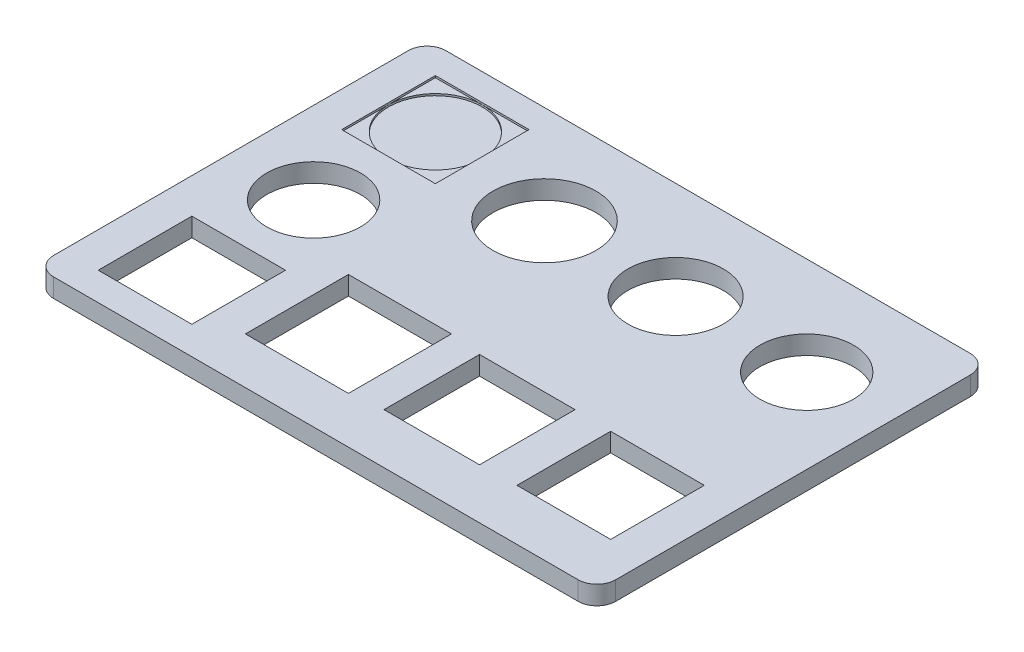
ISO-10303-21;
HEADER;
FILE_DESCRIPTION(('STEP AP214'),'2;1');
FILE_NAME('part.step','',(''),(''),'','','');
FILE_SCHEMA(('AUTOMOTIVE_DESIGN { 1 0 10303 214 1 1 1 1 }'));
ENDSEC;
DATA;
#1=APPLICATION_CONTEXT('core data for automotive mechanical design processes');
#2=APPLICATION_PROTOCOL_DEFINITION('international standard','automotive_design',2000,#1);
#3=PRODUCT_CONTEXT('',#1,'mechanical');
#4=PRODUCT('Part','Part','',(#3));
#5=PRODUCT_RELATED_PRODUCT_CATEGORY('part','',(#4));
#6=PRODUCT_DEFINITION_FORMATION('','',#4);
#7=PRODUCT_DEFINITION_CONTEXT('part definition',#1,'design');
#8=PRODUCT_DEFINITION('design','',#6,#7);
#9=PRODUCT_DEFINITION_SHAPE('','',#8);
#10=(LENGTH_UNIT() NAMED_UNIT(*) SI_UNIT(.MILLI.,.METRE.));
#11=(NAMED_UNIT(*) PLANE_ANGLE_UNIT() SI_UNIT($,.RADIAN.));
#12=(NAMED_UNIT(*) SI_UNIT($,.STERADIAN.) SOLID_ANGLE_UNIT());
#13=UNCERTAINTY_MEASURE_WITH_UNIT(LENGTH_MEASURE(1.E-05),#10,'distance_accuracy_value','');
#14=(GEOMETRIC_REPRESENTATION_CONTEXT(3) GLOBAL_UNCERTAINTY_ASSIGNED_CONTEXT((#13)) GLOBAL_UNIT_ASSIGNED_CONTEXT((#10,
#11,#12)) REPRESENTATION_CONTEXT('',''));
#15=CARTESIAN_POINT('',(0.,0.,0.));
#16=DIRECTION('',(0.,0.,1.));
#17=DIRECTION('',(1.,0.,0.));
#18=AXIS2_PLACEMENT_3D('',#15,#16,#17);
#19=CARTESIAN_POINT('',(0.,9.,0.));
#20=DIRECTION('',(0.,1.,0.));
#21=DIRECTION('',(0.,0.,1.));
#22=AXIS2_PLACEMENT_3D('',#19,#20,#21);
#23=PLANE('',#22);
#24=CARTESIAN_POINT('',(43.75,9.,-170.));
#25=DIRECTION('',(0.,1.,0.));
#26=DIRECTION('',(0.,0.,1.));
#27=AXIS2_PLACEMENT_3D('',#24,#25,#26);
#28=CIRCLE('',#27,25.);
#29=CARTESIAN_POINT('',(43.75,9.,-145.));
#30=VERTEX_POINT('',#29);
#31=CARTESIAN_POINT('',(68.75,9.,-170.));
#32=VERTEX_POINT('',#31);
#33=EDGE_CURVE('E51',#30,#32,#28,.T.);
#34=ORIENTED_EDGE('',*,*,#33,.F.);
#35=DIRECTION('',(1.,0.,0.));
#36=VECTOR('',#35,1.);
#37=CARTESIAN_POINT('',(18.75,9.,-145.));
#38=LINE('',#37,#36);
#39=CARTESIAN_POINT('',(68.75,9.,-145.));
#40=VERTEX_POINT('',#39);
#41=EDGE_CURVE('E244',#30,#40,#38,.T.);
#42=ORIENTED_EDGE('',*,*,#41,.T.);
#43=DIRECTION('',(0.,0.,-1.));
#44=VECTOR('',#43,1.);
#45=CARTESIAN_POINT('',(68.75,9.,-195.));
#46=LINE('',#45,#44);
#47=EDGE_CURVE('E246',#40,#32,#46,.T.);
#48=ORIENTED_EDGE('',*,*,#47,.T.);
#49=EDGE_LOOP('',(#34,#42,#48));
#50=FACE_BOUND('',#49,.T.);
#51=ADVANCED_FACE('F39',(#50),#23,.T.);
#52=CARTESIAN_POINT('',(43.75,9.,-195.));
#53=VERTEX_POINT('',#52);
#54=EDGE_CURVE('E11',#32,#53,#28,.T.);
#55=ORIENTED_EDGE('',*,*,#54,.F.);
#56=CARTESIAN_POINT('',(68.75,9.,-195.));
#57=VERTEX_POINT('',#56);
#58=EDGE_CURVE('E261',#32,#57,#46,.T.);
#59=ORIENTED_EDGE('',*,*,#58,.T.);
#60=DIRECTION('',(-1.,0.,0.));
#61=VECTOR('',#60,1.);
#62=CARTESIAN_POINT('',(18.75,9.,-195.));
#63=LINE('',#62,#61);
#64=EDGE_CURVE('E328',#57,#53,#63,.T.);
#65=ORIENTED_EDGE('',*,*,#64,.T.);
#66=EDGE_LOOP('',(#55,#59,#65));
#67=FACE_BOUND('',#66,.T.);
#68=ADVANCED_FACE('F632',(#67),#23,.T.);
#69=CARTESIAN_POINT('',(18.75,9.,-170.));
#70=VERTEX_POINT('',#69);
#71=EDGE_CURVE('E49',#53,#70,#28,.T.);
#72=ORIENTED_EDGE('',*,*,#71,.F.);
#73=CARTESIAN_POINT('',(18.75,9.,-195.));
#74=VERTEX_POINT('',#73);
#75=EDGE_CURVE('E660',#53,#74,#63,.T.);
#76=ORIENTED_EDGE('',*,*,#75,.T.);
#77=DIRECTION('',(0.,0.,1.));
#78=VECTOR('',#77,1.);
#79=CARTESIAN_POINT('',(18.75,9.,-195.));
#80=LINE('',#79,#78);
#81=EDGE_CURVE('E257',#74,#70,#80,.T.);
#82=ORIENTED_EDGE('',*,*,#81,.T.);
#83=EDGE_LOOP('',(#72,#76,#82));
#84=FACE_BOUND('',#83,.T.);
#85=ADVANCED_FACE('F637',(#84),#23,.T.);
#86=CARTESIAN_POINT('',(0.,10.,0.));
#87=DIRECTION('',(0.,-1.,0.));
#88=DIRECTION('',(0.,0.,-1.));
#89=AXIS2_PLACEMENT_3D('',#86,#87,#88);
#90=PLANE('',#89);
#91=DIRECTION('',(1.,0.,0.));
#92=VECTOR('',#91,1.);
#93=CARTESIAN_POINT('',(68.75,10.,-15.));
#94=LINE('',#93,#92);
#95=CARTESIAN_POINT('',(18.75,10.,-15.));
#96=VERTEX_POINT('',#95);
#97=CARTESIAN_POINT('',(68.75,10.,-15.));
#98=VERTEX_POINT('',#97);
#99=EDGE_CURVE('E290',#96,#98,#94,.T.);
#100=ORIENTED_EDGE('',*,*,#99,.F.);
#101=DIRECTION('',(0.,0.,1.));
#102=VECTOR('',#101,1.);
#103=CARTESIAN_POINT('',(18.75,10.,-15.));
#104=LINE('',#103,#102);
#105=CARTESIAN_POINT('',(18.75,10.,-65.));
#106=VERTEX_POINT('',#105);
#107=EDGE_CURVE('E287',#106,#96,#104,.T.);
#108=ORIENTED_EDGE('',*,*,#107,.F.);
#109=DIRECTION('',(-1.,0.,0.));
#110=VECTOR('',#109,1.);
#111=CARTESIAN_POINT('',(68.75,10.,-65.));
#112=LINE('',#111,#110);
#113=CARTESIAN_POINT('',(68.75,10.,-65.));
#114=VERTEX_POINT('',#113);
#115=EDGE_CURVE('E274',#114,#106,#112,.T.);
#116=ORIENTED_EDGE('',*,*,#115,.F.);
#117=DIRECTION('',(0.,0.,-1.));
#118=VECTOR('',#117,1.);
#119=CARTESIAN_POINT('',(68.75,10.,-15.));
#120=LINE('',#119,#118);
#121=EDGE_CURVE('E295',#98,#114,#120,.T.);
#122=ORIENTED_EDGE('',*,*,#121,.F.);
#123=EDGE_LOOP('',(#100,#108,#116,#122));
#124=FACE_BOUND('',#123,.T.);
#125=CARTESIAN_POINT('',(43.75,10.,-105.));
#126=DIRECTION('',(0.,1.,0.));
#127=DIRECTION('',(0.,0.,1.));
#128=AXIS2_PLACEMENT_3D('',#125,#126,#127);
#129=CIRCLE('',#128,25.);
#130=CARTESIAN_POINT('',(43.75,10.,-80.));
#131=VERTEX_POINT('',#130);
#132=EDGE_CURVE('E318',#131,#131,#129,.T.);
#133=ORIENTED_EDGE('',*,*,#132,.F.);
#134=EDGE_LOOP('',(#133));
#135=FACE_BOUND('',#134,.T.);
#136=DIRECTION('',(1.,0.,0.));
#137=VECTOR('',#136,1.);
#138=CARTESIAN_POINT('',(68.75,10.,-145.));
#139=LINE('',#138,#137);
#140=CARTESIAN_POINT('',(18.75,10.,-145.));
#141=VERTEX_POINT('',#140);
#142=CARTESIAN_POINT('',(68.75,10.,-145.));
#143=VERTEX_POINT('',#142);
#144=EDGE_CURVE('E327',#141,#143,#139,.T.);
#145=ORIENTED_EDGE('',*,*,#144,.F.);
#146=DIRECTION('',(0.,0.,1.));
#147=VECTOR('',#146,1.);
#148=CARTESIAN_POINT('',(18.75,10.,-145.));
#149=LINE('',#148,#147);
#150=CARTESIAN_POINT('',(18.75,10.,-195.));
#151=VERTEX_POINT('',#150);
#152=EDGE_CURVE('E323',#151,#141,#149,.T.);
#153=ORIENTED_EDGE('',*,*,#152,.F.);
#154=DIRECTION('',(-1.,0.,0.));
#155=VECTOR('',#154,1.);
#156=CARTESIAN_POINT('',(68.75,10.,-195.));
#157=LINE('',#156,#155);
#158=CARTESIAN_POINT('',(68.75,10.,-195.));
#159=VERTEX_POINT('',#158);
#160=EDGE_CURVE('E335',#159,#151,#157,.T.);
#161=ORIENTED_EDGE('',*,*,#160,.F.);
#162=DIRECTION('',(0.,0.,-1.));
#163=VECTOR('',#162,1.);
#164=CARTESIAN_POINT('',(68.75,10.,-145.));
#165=LINE('',#164,#163);
#166=EDGE_CURVE('E331',#143,#159,#165,.T.);
#167=ORIENTED_EDGE('',*,*,#166,.F.);
#168=EDGE_LOOP('',(#145,#153,#161,#167));
#169=FACE_BOUND('',#168,.T.);
#170=DIRECTION('',(0.,0.,-1.));
#171=VECTOR('',#170,1.);
#172=CARTESIAN_POINT('',(210.5,10.,-26.833));
#173=LINE('',#172,#171);
#174=CARTESIAN_POINT('',(210.5,10.,-26.833));
#175=VERTEX_POINT('',#174);
#176=CARTESIAN_POINT('',(210.5,10.,-77.833));
#177=VERTEX_POINT('',#176);
#178=EDGE_CURVE('E392',#175,#177,#173,.T.);
#179=ORIENTED_EDGE('',*,*,#178,.F.);
#180=DIRECTION('',(1.,0.,0.));
#181=VECTOR('',#180,1.);
#182=CARTESIAN_POINT('',(159.5,10.,-26.833));
#183=LINE('',#182,#181);
#184=CARTESIAN_POINT('',(159.5,10.,-26.833));
#185=VERTEX_POINT('',#184);
#186=EDGE_CURVE('E403',#185,#175,#183,.T.);
#187=ORIENTED_EDGE('',*,*,#186,.F.);
#188=DIRECTION('',(0.,0.,1.));
#189=VECTOR('',#188,1.);
#190=CARTESIAN_POINT('',(159.5,10.,-26.833));
#191=LINE('',#190,#189);
#192=CARTESIAN_POINT('',(159.5,10.,-77.833));
#193=VERTEX_POINT('',#192);
#194=EDGE_CURVE('E399',#193,#185,#191,.T.);
#195=ORIENTED_EDGE('',*,*,#194,.F.);
#196=DIRECTION('',(-1.,0.,0.));
#197=VECTOR('',#196,1.);
#198=CARTESIAN_POINT('',(159.5,10.,-77.833));
#199=LINE('',#198,#197);
#200=EDGE_CURVE('E395',#177,#193,#199,.T.);
#201=ORIENTED_EDGE('',*,*,#200,.F.);
#202=EDGE_LOOP('',(#179,#187,#195,#201));
#203=FACE_BOUND('',#202,.T.);
#204=CARTESIAN_POINT('',(115.,10.,-156.999));
#205=DIRECTION('',(0.,1.,0.));
#206=DIRECTION('',(0.,0.,1.));
#207=AXIS2_PLACEMENT_3D('',#204,#205,#206);
#208=CIRCLE('',#207,27.5);
#209=CARTESIAN_POINT('',(115.,10.,-129.499));
#210=VERTEX_POINT('',#209);
#211=EDGE_CURVE('E494',#210,#210,#208,.T.);
#212=ORIENTED_EDGE('',*,*,#211,.F.);
#213=EDGE_LOOP('',(#212));
#214=FACE_BOUND('',#213,.T.);
#215=DIRECTION('',(0.,0.,1.));
#216=VECTOR('',#215,1.);
#217=CARTESIAN_POINT('',(0.,10.,0.));
#218=LINE('',#217,#216);
#219=CARTESIAN_POINT('',(0.,10.,-199.332));
#220=VERTEX_POINT('',#219);
#221=CARTESIAN_POINT('',(0.,10.,-9.99999999999999));
#222=VERTEX_POINT('',#221);
#223=EDGE_CURVE('E502',#220,#222,#218,.T.);
#224=ORIENTED_EDGE('',*,*,#223,.T.);
#225=CARTESIAN_POINT('',(10.,10.,-9.99999999999999));
#226=DIRECTION('',(0.,-1.,0.));
#227=DIRECTION('',(0.,0.,-1.));
#228=AXIS2_PLACEMENT_3D('',#225,#226,#227);
#229=CIRCLE('',#228,10.);
#230=CARTESIAN_POINT('',(9.99999999999999,10.,0.));
#231=VERTEX_POINT('',#230);
#232=EDGE_CURVE('E568',#222,#231,#229,.F.);
#233=ORIENTED_EDGE('',*,*,#232,.T.);
#234=DIRECTION('',(1.,0.,0.));
#235=VECTOR('',#234,1.);
#236=CARTESIAN_POINT('',(0.,10.,0.));
#237=LINE('',#236,#235);
#238=CARTESIAN_POINT('',(290.,10.,1.60982338570648E-13));
#239=VERTEX_POINT('',#238);
#240=EDGE_CURVE('E506',#231,#239,#237,.T.);
#241=ORIENTED_EDGE('',*,*,#240,.T.);
#242=CARTESIAN_POINT('',(290.,10.,-9.99999999999984));
#243=DIRECTION('',(0.,-1.,0.));
#244=DIRECTION('',(0.,0.,-1.));
#245=AXIS2_PLACEMENT_3D('',#242,#243,#244);
#246=CIRCLE('',#245,10.);
#247=CARTESIAN_POINT('',(300.,10.,-9.99999999999984));
#248=VERTEX_POINT('',#247);
#249=EDGE_CURVE('E559',#239,#248,#246,.F.);
#250=ORIENTED_EDGE('',*,*,#249,.T.);
#251=DIRECTION('',(0.,0.,-1.));
#252=VECTOR('',#251,1.);
#253=CARTESIAN_POINT('',(300.,10.,1.66533453693773E-13));
#254=LINE('',#253,#252);
#255=CARTESIAN_POINT('',(300.,10.,-199.332));
#256=VERTEX_POINT('',#255);
#257=EDGE_CURVE('E511',#248,#256,#254,.T.);
#258=ORIENTED_EDGE('',*,*,#257,.T.);
#259=CARTESIAN_POINT('',(290.,10.,-199.332));
#260=DIRECTION('',(0.,-1.,0.));
#261=DIRECTION('',(0.,0.,-1.));
#262=AXIS2_PLACEMENT_3D('',#259,#260,#261);
#263=CIRCLE('',#262,10.);
#264=CARTESIAN_POINT('',(290.,10.,-209.332));
#265=VERTEX_POINT('',#264);
#266=EDGE_CURVE('E562',#256,#265,#263,.F.);
#267=ORIENTED_EDGE('',*,*,#266,.T.);
#268=DIRECTION('',(-1.,0.,0.));
#269=VECTOR('',#268,1.);
#270=CARTESIAN_POINT('',(0.,10.,-209.332));
#271=LINE('',#270,#269);
#272=CARTESIAN_POINT('',(10.,10.,-209.332));
#273=VERTEX_POINT('',#272);
#274=EDGE_CURVE('E515',#265,#273,#271,.T.);
#275=ORIENTED_EDGE('',*,*,#274,.T.);
#276=CARTESIAN_POINT('',(10.,10.,-199.332));
#277=DIRECTION('',(0.,-1.,0.));
#278=DIRECTION('',(0.,0.,-1.));
#279=AXIS2_PLACEMENT_3D('',#276,#277,#278);
#280=CIRCLE('',#279,10.);
#281=EDGE_CURVE('E565',#273,#220,#280,.F.);
#282=ORIENTED_EDGE('',*,*,#281,.T.);
#283=EDGE_LOOP('',(#224,#233,#241,#250,#258,#267,#275,#282));
#284=FACE_BOUND('',#283,.T.);
#285=DIRECTION('',(0.,0.,-1.));
#286=VECTOR('',#285,1.);
#287=CARTESIAN_POINT('',(142.5,10.,-24.833));
#288=LINE('',#287,#286);
#289=CARTESIAN_POINT('',(142.5,10.,-24.833));
#290=VERTEX_POINT('',#289);
#291=CARTESIAN_POINT('',(142.5,10.,-79.833));
#292=VERTEX_POINT('',#291);
#293=EDGE_CURVE('E451',#290,#292,#288,.T.);
#294=ORIENTED_EDGE('',*,*,#293,.F.);
#295=DIRECTION('',(1.,0.,0.));
#296=VECTOR('',#295,1.);
#297=CARTESIAN_POINT('',(87.5,10.,-24.833));
#298=LINE('',#297,#296);
#299=CARTESIAN_POINT('',(87.5,10.,-24.833));
#300=VERTEX_POINT('',#299);
#301=EDGE_CURVE('E462',#300,#290,#298,.T.);
#302=ORIENTED_EDGE('',*,*,#301,.F.);
#303=DIRECTION('',(0.,0.,1.));
#304=VECTOR('',#303,1.);
#305=CARTESIAN_POINT('',(87.5,10.,-24.833));
#306=LINE('',#305,#304);
#307=CARTESIAN_POINT('',(87.5,10.,-79.833));
#308=VERTEX_POINT('',#307);
#309=EDGE_CURVE('E458',#308,#300,#306,.T.);
#310=ORIENTED_EDGE('',*,*,#309,.F.);
#311=DIRECTION('',(-1.,0.,0.));
#312=VECTOR('',#311,1.);
#313=CARTESIAN_POINT('',(87.5,10.,-79.833));
#314=LINE('',#313,#312);
#315=EDGE_CURVE('E454',#292,#308,#314,.T.);
#316=ORIENTED_EDGE('',*,*,#315,.F.);
#317=EDGE_LOOP('',(#294,#302,#310,#316));
#318=FACE_BOUND('',#317,.T.);
#319=CARTESIAN_POINT('',(185.,10.,-156.999));
#320=DIRECTION('',(0.,1.,0.));
#321=DIRECTION('',(0.,0.,1.));
#322=AXIS2_PLACEMENT_3D('',#319,#320,#321);
#323=CIRCLE('',#322,25.5);
#324=CARTESIAN_POINT('',(185.,10.,-131.499));
#325=VERTEX_POINT('',#324);
#326=EDGE_CURVE('E443',#325,#325,#323,.T.);
#327=ORIENTED_EDGE('',*,*,#326,.F.);
#328=EDGE_LOOP('',(#327));
#329=FACE_BOUND('',#328,.T.);
#330=CARTESIAN_POINT('',(255.,10.,-156.999));
#331=DIRECTION('',(0.,1.,0.));
#332=DIRECTION('',(0.,0.,1.));
#333=AXIS2_PLACEMENT_3D('',#330,#331,#332);
#334=CIRCLE('',#333,25.);
#335=CARTESIAN_POINT('',(255.,10.,-131.999));
#336=VERTEX_POINT('',#335);
#337=EDGE_CURVE('E435',#336,#336,#334,.T.);
#338=ORIENTED_EDGE('',*,*,#337,.F.);
#339=EDGE_LOOP('',(#338));
#340=FACE_BOUND('',#339,.T.);
#341=DIRECTION('',(0.,0.,1.));
#342=VECTOR('',#341,1.);
#343=CARTESIAN_POINT('',(230.,10.,-27.333));
#344=LINE('',#343,#342);
#345=CARTESIAN_POINT('',(230.,10.,-77.333));
#346=VERTEX_POINT('',#345);
#347=CARTESIAN_POINT('',(230.,10.,-27.333));
#348=VERTEX_POINT('',#347);
#349=EDGE_CURVE('E349',#346,#348,#344,.T.);
#350=ORIENTED_EDGE('',*,*,#349,.F.);
#351=DIRECTION('',(-1.,0.,0.));
#352=VECTOR('',#351,1.);
#353=CARTESIAN_POINT('',(280.,10.,-77.333));
#354=LINE('',#353,#352);
#355=CARTESIAN_POINT('',(280.,10.,-77.333));
#356=VERTEX_POINT('',#355);
#357=EDGE_CURVE('E360',#356,#346,#354,.T.);
#358=ORIENTED_EDGE('',*,*,#357,.F.);
#359=DIRECTION('',(0.,0.,-1.));
#360=VECTOR('',#359,1.);
#361=CARTESIAN_POINT('',(280.,10.,-27.333));
#362=LINE('',#361,#360);
#363=CARTESIAN_POINT('',(280.,10.,-27.333));
#364=VERTEX_POINT('',#363);
#365=EDGE_CURVE('E356',#364,#356,#362,.T.);
#366=ORIENTED_EDGE('',*,*,#365,.F.);
#367=DIRECTION('',(1.,0.,0.));
#368=VECTOR('',#367,1.);
#369=CARTESIAN_POINT('',(280.,10.,-27.333));
#370=LINE('',#369,#368);
#371=EDGE_CURVE('E352',#348,#364,#370,.T.);
#372=ORIENTED_EDGE('',*,*,#371,.F.);
#373=EDGE_LOOP('',(#350,#358,#366,#372));
#374=FACE_BOUND('',#373,.T.);
#375=ADVANCED_FACE('F590',(#124,#135,#169,#203,#214,#284,#318,#329,#340,#374),#90,.F.);
#376=CARTESIAN_POINT('',(0.,0.,0.));
#377=DIRECTION('',(0.,-1.,0.));
#378=DIRECTION('',(0.,0.,-1.));
#379=AXIS2_PLACEMENT_3D('',#376,#377,#378);
#380=PLANE('',#379);
#381=DIRECTION('',(0.,0.,1.));
#382=VECTOR('',#381,1.);
#383=CARTESIAN_POINT('',(18.75,0.,-15.));
#384=LINE('',#383,#382);
#385=CARTESIAN_POINT('',(18.75,0.,-65.));
#386=VERTEX_POINT('',#385);
#387=CARTESIAN_POINT('',(18.75,0.,-15.));
#388=VERTEX_POINT('',#387);
#389=EDGE_CURVE('E269',#386,#388,#384,.T.);
#390=ORIENTED_EDGE('',*,*,#389,.T.);
#391=DIRECTION('',(1.,0.,0.));
#392=VECTOR('',#391,1.);
#393=CARTESIAN_POINT('',(68.75,0.,-15.));
#394=LINE('',#393,#392);
#395=CARTESIAN_POINT('',(68.75,0.,-15.));
#396=VERTEX_POINT('',#395);
#397=EDGE_CURVE('E273',#388,#396,#394,.T.);
#398=ORIENTED_EDGE('',*,*,#397,.T.);
#399=DIRECTION('',(0.,0.,-1.));
#400=VECTOR('',#399,1.);
#401=CARTESIAN_POINT('',(68.75,0.,-15.));
#402=LINE('',#401,#400);
#403=CARTESIAN_POINT('',(68.75,0.,-65.));
#404=VERTEX_POINT('',#403);
#405=EDGE_CURVE('E278',#396,#404,#402,.T.);
#406=ORIENTED_EDGE('',*,*,#405,.T.);
#407=DIRECTION('',(-1.,0.,0.));
#408=VECTOR('',#407,1.);
#409=CARTESIAN_POINT('',(68.75,0.,-65.));
#410=LINE('',#409,#408);
#411=EDGE_CURVE('E282',#404,#386,#410,.T.);
#412=ORIENTED_EDGE('',*,*,#411,.T.);
#413=EDGE_LOOP('',(#390,#398,#406,#412));
#414=FACE_BOUND('',#413,.T.);
#415=CARTESIAN_POINT('',(43.75,0.,-105.));
#416=DIRECTION('',(0.,1.,0.));
#417=DIRECTION('',(0.,0.,1.));
#418=AXIS2_PLACEMENT_3D('',#415,#416,#417);
#419=CIRCLE('',#418,25.);
#420=CARTESIAN_POINT('',(43.75,0.,-80.));
#421=VERTEX_POINT('',#420);
#422=EDGE_CURVE('E291',#421,#421,#419,.T.);
#423=ORIENTED_EDGE('',*,*,#422,.T.);
#424=EDGE_LOOP('',(#423));
#425=FACE_BOUND('',#424,.T.);
#426=CARTESIAN_POINT('',(185.,0.,-156.999));
#427=DIRECTION('',(0.,1.,0.));
#428=DIRECTION('',(0.,0.,1.));
#429=AXIS2_PLACEMENT_3D('',#426,#427,#428);
#430=CIRCLE('',#429,25.5);
#431=CARTESIAN_POINT('',(185.,0.,-131.499));
#432=VERTEX_POINT('',#431);
#433=EDGE_CURVE('E439',#432,#432,#430,.T.);
#434=ORIENTED_EDGE('',*,*,#433,.T.);
#435=EDGE_LOOP('',(#434));
#436=FACE_BOUND('',#435,.T.);
#437=DIRECTION('',(1.,0.,0.));
#438=VECTOR('',#437,1.);
#439=CARTESIAN_POINT('',(0.,0.,0.));
#440=LINE('',#439,#438);
#441=CARTESIAN_POINT('',(9.99999999999999,0.,0.));
#442=VERTEX_POINT('',#441);
#443=CARTESIAN_POINT('',(290.,0.,1.60982338570648E-13));
#444=VERTEX_POINT('',#443);
#445=EDGE_CURVE('E523',#442,#444,#440,.T.);
#446=ORIENTED_EDGE('',*,*,#445,.F.);
#447=CARTESIAN_POINT('',(10.,0.,-9.99999999999999));
#448=DIRECTION('',(0.,-1.,0.));
#449=DIRECTION('',(0.,0.,-1.));
#450=AXIS2_PLACEMENT_3D('',#447,#448,#449);
#451=CIRCLE('',#450,10.);
#452=CARTESIAN_POINT('',(0.,0.,-9.99999999999999));
#453=VERTEX_POINT('',#452);
#454=EDGE_CURVE('E549',#442,#453,#451,.T.);
#455=ORIENTED_EDGE('',*,*,#454,.T.);
#456=DIRECTION('',(0.,0.,1.));
#457=VECTOR('',#456,1.);
#458=CARTESIAN_POINT('',(0.,0.,0.));
#459=LINE('',#458,#457);
#460=CARTESIAN_POINT('',(0.,0.,-199.332));
#461=VERTEX_POINT('',#460);
#462=EDGE_CURVE('E498',#461,#453,#459,.T.);
#463=ORIENTED_EDGE('',*,*,#462,.F.);
#464=CARTESIAN_POINT('',(10.,0.,-199.332));
#465=DIRECTION('',(0.,-1.,0.));
#466=DIRECTION('',(0.,0.,-1.));
#467=AXIS2_PLACEMENT_3D('',#464,#465,#466);
#468=CIRCLE('',#467,10.);
#469=CARTESIAN_POINT('',(10.,0.,-209.332));
#470=VERTEX_POINT('',#469);
#471=EDGE_CURVE('E546',#461,#470,#468,.T.);
#472=ORIENTED_EDGE('',*,*,#471,.T.);
#473=DIRECTION('',(-1.,0.,0.));
#474=VECTOR('',#473,1.);
#475=CARTESIAN_POINT('',(0.,0.,-209.332));
#476=LINE('',#475,#474);
#477=CARTESIAN_POINT('',(290.,0.,-209.332));
#478=VERTEX_POINT('',#477);
#479=EDGE_CURVE('E507',#478,#470,#476,.T.);
#480=ORIENTED_EDGE('',*,*,#479,.F.);
#481=CARTESIAN_POINT('',(290.,0.,-199.332));
#482=DIRECTION('',(0.,-1.,0.));
#483=DIRECTION('',(0.,0.,-1.));
#484=AXIS2_PLACEMENT_3D('',#481,#482,#483);
#485=CIRCLE('',#484,10.);
#486=CARTESIAN_POINT('',(300.,0.,-199.332));
#487=VERTEX_POINT('',#486);
#488=EDGE_CURVE('E543',#478,#487,#485,.T.);
#489=ORIENTED_EDGE('',*,*,#488,.T.);
#490=DIRECTION('',(0.,0.,-1.));
#491=VECTOR('',#490,1.);
#492=CARTESIAN_POINT('',(300.,0.,1.66533453693773E-13));
#493=LINE('',#492,#491);
#494=CARTESIAN_POINT('',(300.,0.,-9.99999999999984));
#495=VERTEX_POINT('',#494);
#496=EDGE_CURVE('E527',#495,#487,#493,.T.);
#497=ORIENTED_EDGE('',*,*,#496,.F.);
#498=CARTESIAN_POINT('',(290.,0.,-9.99999999999984));
#499=DIRECTION('',(0.,-1.,0.));
#500=DIRECTION('',(0.,0.,-1.));
#501=AXIS2_PLACEMENT_3D('',#498,#499,#500);
#502=CIRCLE('',#501,10.);
#503=EDGE_CURVE('E540',#495,#444,#502,.T.);
#504=ORIENTED_EDGE('',*,*,#503,.T.);
#505=EDGE_LOOP('',(#446,#455,#463,#472,#480,#489,#497,#504));
#506=FACE_BOUND('',#505,.T.);
#507=CARTESIAN_POINT('',(115.,0.,-156.999));
#508=DIRECTION('',(0.,1.,0.));
#509=DIRECTION('',(0.,0.,1.));
#510=AXIS2_PLACEMENT_3D('',#507,#508,#509);
#511=CIRCLE('',#510,27.5);
#512=CARTESIAN_POINT('',(115.,0.,-129.499));
#513=VERTEX_POINT('',#512);
#514=EDGE_CURVE('E493',#513,#513,#511,.T.);
#515=ORIENTED_EDGE('',*,*,#514,.T.);
#516=EDGE_LOOP('',(#515));
#517=FACE_BOUND('',#516,.T.);
#518=DIRECTION('',(1.,0.,0.));
#519=VECTOR('',#518,1.);
#520=CARTESIAN_POINT('',(87.5,0.,-24.833));
#521=LINE('',#520,#519);
#522=CARTESIAN_POINT('',(87.5,0.,-24.833));
#523=VERTEX_POINT('',#522);
#524=CARTESIAN_POINT('',(142.5,0.,-24.833));
#525=VERTEX_POINT('',#524);
#526=EDGE_CURVE('E455',#523,#525,#521,.T.);
#527=ORIENTED_EDGE('',*,*,#526,.T.);
#528=DIRECTION('',(0.,0.,-1.));
#529=VECTOR('',#528,1.);
#530=CARTESIAN_POINT('',(142.5,0.,-24.833));
#531=LINE('',#530,#529);
#532=CARTESIAN_POINT('',(142.5,0.,-79.833));
#533=VERTEX_POINT('',#532);
#534=EDGE_CURVE('E447',#525,#533,#531,.T.);
#535=ORIENTED_EDGE('',*,*,#534,.T.);
#536=DIRECTION('',(-1.,0.,0.));
#537=VECTOR('',#536,1.);
#538=CARTESIAN_POINT('',(87.5,0.,-79.833));
#539=LINE('',#538,#537);
#540=CARTESIAN_POINT('',(87.5,0.,-79.833));
#541=VERTEX_POINT('',#540);
#542=EDGE_CURVE('E469',#533,#541,#539,.T.);
#543=ORIENTED_EDGE('',*,*,#542,.T.);
#544=DIRECTION('',(0.,0.,1.));
#545=VECTOR('',#544,1.);
#546=CARTESIAN_POINT('',(87.5,0.,-24.833));
#547=LINE('',#546,#545);
#548=EDGE_CURVE('E473',#541,#523,#547,.T.);
#549=ORIENTED_EDGE('',*,*,#548,.T.);
#550=EDGE_LOOP('',(#527,#535,#543,#549));
#551=FACE_BOUND('',#550,.T.);
#552=CARTESIAN_POINT('',(255.,0.,-156.999));
#553=DIRECTION('',(0.,1.,0.));
#554=DIRECTION('',(0.,0.,1.));
#555=AXIS2_PLACEMENT_3D('',#552,#553,#554);
#556=CIRCLE('',#555,25.);
#557=CARTESIAN_POINT('',(255.,0.,-131.999));
#558=VERTEX_POINT('',#557);
#559=EDGE_CURVE('E434',#558,#558,#556,.T.);
#560=ORIENTED_EDGE('',*,*,#559,.T.);
#561=EDGE_LOOP('',(#560));
#562=FACE_BOUND('',#561,.T.);
#563=DIRECTION('',(1.,0.,0.));
#564=VECTOR('',#563,1.);
#565=CARTESIAN_POINT('',(159.5,0.,-26.833));
#566=LINE('',#565,#564);
#567=CARTESIAN_POINT('',(159.5,0.,-26.833));
#568=VERTEX_POINT('',#567);
#569=CARTESIAN_POINT('',(210.5,0.,-26.833));
#570=VERTEX_POINT('',#569);
#571=EDGE_CURVE('E396',#568,#570,#566,.T.);
#572=ORIENTED_EDGE('',*,*,#571,.T.);
#573=DIRECTION('',(0.,0.,-1.));
#574=VECTOR('',#573,1.);
#575=CARTESIAN_POINT('',(210.5,0.,-26.833));
#576=LINE('',#575,#574);
#577=CARTESIAN_POINT('',(210.5,0.,-77.833));
#578=VERTEX_POINT('',#577);
#579=EDGE_CURVE('E391',#570,#578,#576,.T.);
#580=ORIENTED_EDGE('',*,*,#579,.T.);
#581=DIRECTION('',(-1.,0.,0.));
#582=VECTOR('',#581,1.);
#583=CARTESIAN_POINT('',(159.5,0.,-77.833));
#584=LINE('',#583,#582);
#585=CARTESIAN_POINT('',(159.5,0.,-77.833));
#586=VERTEX_POINT('',#585);
#587=EDGE_CURVE('E410',#578,#586,#584,.T.);
#588=ORIENTED_EDGE('',*,*,#587,.T.);
#589=DIRECTION('',(0.,0.,1.));
#590=VECTOR('',#589,1.);
#591=CARTESIAN_POINT('',(159.5,0.,-26.833));
#592=LINE('',#591,#590);
#593=EDGE_CURVE('E414',#586,#568,#592,.T.);
#594=ORIENTED_EDGE('',*,*,#593,.T.);
#595=EDGE_LOOP('',(#572,#580,#588,#594));
#596=FACE_BOUND('',#595,.T.);
#597=DIRECTION('',(-1.,0.,0.));
#598=VECTOR('',#597,1.);
#599=CARTESIAN_POINT('',(280.,0.,-77.333));
#600=LINE('',#599,#598);
#601=CARTESIAN_POINT('',(280.,0.,-77.333));
#602=VERTEX_POINT('',#601);
#603=CARTESIAN_POINT('',(230.,0.,-77.333));
#604=VERTEX_POINT('',#603);
#605=EDGE_CURVE('E353',#602,#604,#600,.T.);
#606=ORIENTED_EDGE('',*,*,#605,.T.);
#607=DIRECTION('',(0.,0.,1.));
#608=VECTOR('',#607,1.);
#609=CARTESIAN_POINT('',(230.,0.,-27.333));
#610=LINE('',#609,#608);
#611=CARTESIAN_POINT('',(230.,0.,-27.333));
#612=VERTEX_POINT('',#611);
#613=EDGE_CURVE('E305',#604,#612,#610,.T.);
#614=ORIENTED_EDGE('',*,*,#613,.T.);
#615=DIRECTION('',(1.,0.,0.));
#616=VECTOR('',#615,1.);
#617=CARTESIAN_POINT('',(280.,0.,-27.333));
#618=LINE('',#617,#616);
#619=CARTESIAN_POINT('',(280.,0.,-27.333));
#620=VERTEX_POINT('',#619);
#621=EDGE_CURVE('E367',#612,#620,#618,.T.);
#622=ORIENTED_EDGE('',*,*,#621,.T.);
#623=DIRECTION('',(0.,0.,-1.));
#624=VECTOR('',#623,1.);
#625=CARTESIAN_POINT('',(280.,0.,-27.333));
#626=LINE('',#625,#624);
#627=EDGE_CURVE('E371',#620,#602,#626,.T.);
#628=ORIENTED_EDGE('',*,*,#627,.T.);
#629=EDGE_LOOP('',(#606,#614,#622,#628));
#630=FACE_BOUND('',#629,.T.);
#631=ADVANCED_FACE('F602',(#414,#425,#436,#506,#517,#551,#562,#596,#630),#380,.T.);
#632=CARTESIAN_POINT('',(0.,10.,0.));
#633=DIRECTION('',(1.,0.,0.));
#634=DIRECTION('',(0.,0.,-1.));
#635=AXIS2_PLACEMENT_3D('',#632,#633,#634);
#636=PLANE('',#635);
#637=ORIENTED_EDGE('',*,*,#462,.T.);
#638=DIRECTION('',(0.,-1.,0.));
#639=VECTOR('',#638,1.);
#640=CARTESIAN_POINT('',(0.,10.,-9.99999999999999));
#641=LINE('',#640,#639);
#642=EDGE_CURVE('E556',#453,#222,#641,.F.);
#643=ORIENTED_EDGE('',*,*,#642,.T.);
#644=ORIENTED_EDGE('',*,*,#223,.F.);
#645=DIRECTION('',(0.,-1.,0.));
#646=VECTOR('',#645,1.);
#647=CARTESIAN_POINT('',(0.,10.,-199.332));
#648=LINE('',#647,#646);
#649=EDGE_CURVE('E552',#220,#461,#648,.T.);
#650=ORIENTED_EDGE('',*,*,#649,.T.);
#651=EDGE_LOOP('',(#637,#643,#644,#650));
#652=FACE_BOUND('',#651,.T.);
#653=ADVANCED_FACE('F611',(#652),#636,.F.);
#654=CARTESIAN_POINT('',(0.,10.,0.));
#655=DIRECTION('',(0.,0.,-1.));
#656=DIRECTION('',(-1.,0.,0.));
#657=AXIS2_PLACEMENT_3D('',#654,#655,#656);
#658=PLANE('',#657);
#659=ORIENTED_EDGE('',*,*,#240,.F.);
#660=DIRECTION('',(0.,-1.,0.));
#661=VECTOR('',#660,1.);
#662=CARTESIAN_POINT('',(9.99999999999999,10.,0.));
#663=LINE('',#662,#661);
#664=EDGE_CURVE('E536',#231,#442,#663,.T.);
#665=ORIENTED_EDGE('',*,*,#664,.T.);
#666=ORIENTED_EDGE('',*,*,#445,.T.);
#667=DIRECTION('',(0.,-1.,0.));
#668=VECTOR('',#667,1.);
#669=CARTESIAN_POINT('',(290.,10.,1.60982338570648E-13));
#670=LINE('',#669,#668);
#671=EDGE_CURVE('E519',#444,#239,#670,.F.);
#672=ORIENTED_EDGE('',*,*,#671,.T.);
#673=EDGE_LOOP('',(#659,#665,#666,#672));
#674=FACE_BOUND('',#673,.T.);
#675=ADVANCED_FACE('F619',(#674),#658,.F.);
#676=CARTESIAN_POINT('',(300.,10.,1.66533453693773E-13));
#677=DIRECTION('',(-1.,0.,0.));
#678=DIRECTION('',(0.,0.,1.));
#679=AXIS2_PLACEMENT_3D('',#676,#677,#678);
#680=PLANE('',#679);
#681=ORIENTED_EDGE('',*,*,#496,.T.);
#682=DIRECTION('',(0.,-1.,0.));
#683=VECTOR('',#682,1.);
#684=CARTESIAN_POINT('',(300.,10.,-199.332));
#685=LINE('',#684,#683);
#686=EDGE_CURVE('E43',#487,#256,#685,.F.);
#687=ORIENTED_EDGE('',*,*,#686,.T.);
#688=ORIENTED_EDGE('',*,*,#257,.F.);
#689=DIRECTION('',(0.,-1.,0.));
#690=VECTOR('',#689,1.);
#691=CARTESIAN_POINT('',(300.,10.,-9.99999999999984));
#692=LINE('',#691,#690);
#693=EDGE_CURVE('E577',#248,#495,#692,.T.);
#694=ORIENTED_EDGE('',*,*,#693,.T.);
#695=EDGE_LOOP('',(#681,#687,#688,#694));
#696=FACE_BOUND('',#695,.T.);
#697=ADVANCED_FACE('F586',(#696),#680,.F.);
#698=CARTESIAN_POINT('',(0.,10.,-209.332));
#699=DIRECTION('',(0.,0.,1.));
#700=DIRECTION('',(1.,0.,0.));
#701=AXIS2_PLACEMENT_3D('',#698,#699,#700);
#702=PLANE('',#701);
#703=ORIENTED_EDGE('',*,*,#479,.T.);
#704=DIRECTION('',(0.,-1.,0.));
#705=VECTOR('',#704,1.);
#706=CARTESIAN_POINT('',(10.,10.,-209.332));
#707=LINE('',#706,#705);
#708=EDGE_CURVE('E575',#470,#273,#707,.F.);
#709=ORIENTED_EDGE('',*,*,#708,.T.);
#710=ORIENTED_EDGE('',*,*,#274,.F.);
#711=DIRECTION('',(0.,-1.,0.));
#712=VECTOR('',#711,1.);
#713=CARTESIAN_POINT('',(290.,10.,-209.332));
#714=LINE('',#713,#712);
#715=EDGE_CURVE('E571',#265,#478,#714,.T.);
#716=ORIENTED_EDGE('',*,*,#715,.T.);
#717=EDGE_LOOP('',(#703,#709,#710,#716));
#718=FACE_BOUND('',#717,.T.);
#719=ADVANCED_FACE('F598',(#718),#702,.F.);
#720=CARTESIAN_POINT('',(115.,10.,-156.999));
#721=DIRECTION('',(0.,-1.,0.));
#722=DIRECTION('',(0.,0.,-1.));
#723=AXIS2_PLACEMENT_3D('',#720,#721,#722);
#724=CYLINDRICAL_SURFACE('',#723,27.5);
#725=ORIENTED_EDGE('',*,*,#211,.T.);
#726=EDGE_LOOP('',(#725));
#727=FACE_BOUND('',#726,.T.);
#728=ORIENTED_EDGE('',*,*,#514,.F.);
#729=EDGE_LOOP('',(#728));
#730=FACE_BOUND('',#729,.T.);
#731=ADVANCED_FACE('F835',(#727,#730),#724,.F.);
#732=CARTESIAN_POINT('',(142.5,10.,-24.833));
#733=DIRECTION('',(-1.,0.,0.));
#734=DIRECTION('',(0.,0.,1.));
#735=AXIS2_PLACEMENT_3D('',#732,#733,#734);
#736=PLANE('',#735);
#737=ORIENTED_EDGE('',*,*,#534,.F.);
#738=DIRECTION('',(0.,-1.,0.));
#739=VECTOR('',#738,1.);
#740=CARTESIAN_POINT('',(142.5,10.,-24.833));
#741=LINE('',#740,#739);
#742=EDGE_CURVE('E465',#290,#525,#741,.T.);
#743=ORIENTED_EDGE('',*,*,#742,.F.);
#744=ORIENTED_EDGE('',*,*,#293,.T.);
#745=DIRECTION('',(0.,-1.,0.));
#746=VECTOR('',#745,1.);
#747=CARTESIAN_POINT('',(142.5,10.,-79.833));
#748=LINE('',#747,#746);
#749=EDGE_CURVE('E489',#292,#533,#748,.T.);
#750=ORIENTED_EDGE('',*,*,#749,.T.);
#751=EDGE_LOOP('',(#737,#743,#744,#750));
#752=FACE_BOUND('',#751,.T.);
#753=ADVANCED_FACE('F989',(#752),#736,.T.);
#754=CARTESIAN_POINT('',(87.5,10.,-79.833));
#755=DIRECTION('',(0.,0.,1.));
#756=DIRECTION('',(1.,0.,0.));
#757=AXIS2_PLACEMENT_3D('',#754,#755,#756);
#758=PLANE('',#757);
#759=ORIENTED_EDGE('',*,*,#542,.F.);
#760=ORIENTED_EDGE('',*,*,#749,.F.);
#761=ORIENTED_EDGE('',*,*,#315,.T.);
#762=DIRECTION('',(0.,-1.,0.));
#763=VECTOR('',#762,1.);
#764=CARTESIAN_POINT('',(87.5,10.,-79.833));
#765=LINE('',#764,#763);
#766=EDGE_CURVE('E486',#308,#541,#765,.T.);
#767=ORIENTED_EDGE('',*,*,#766,.T.);
#768=EDGE_LOOP('',(#759,#760,#761,#767));
#769=FACE_BOUND('',#768,.T.);
#770=ADVANCED_FACE('F979',(#769),#758,.T.);
#771=CARTESIAN_POINT('',(87.5,10.,-24.833));
#772=DIRECTION('',(1.,0.,0.));
#773=DIRECTION('',(0.,0.,-1.));
#774=AXIS2_PLACEMENT_3D('',#771,#772,#773);
#775=PLANE('',#774);
#776=ORIENTED_EDGE('',*,*,#548,.F.);
#777=ORIENTED_EDGE('',*,*,#766,.F.);
#778=ORIENTED_EDGE('',*,*,#309,.T.);
#779=DIRECTION('',(0.,-1.,0.));
#780=VECTOR('',#779,1.);
#781=CARTESIAN_POINT('',(87.5,10.,-24.833));
#782=LINE('',#781,#780);
#783=EDGE_CURVE('E483',#300,#523,#782,.T.);
#784=ORIENTED_EDGE('',*,*,#783,.T.);
#785=EDGE_LOOP('',(#776,#777,#778,#784));
#786=FACE_BOUND('',#785,.T.);
#787=ADVANCED_FACE('F969',(#786),#775,.T.);
#788=CARTESIAN_POINT('',(87.5,10.,-24.833));
#789=DIRECTION('',(0.,0.,-1.));
#790=DIRECTION('',(-1.,0.,0.));
#791=AXIS2_PLACEMENT_3D('',#788,#789,#790);
#792=PLANE('',#791);
#793=ORIENTED_EDGE('',*,*,#526,.F.);
#794=ORIENTED_EDGE('',*,*,#783,.F.);
#795=ORIENTED_EDGE('',*,*,#301,.T.);
#796=ORIENTED_EDGE('',*,*,#742,.T.);
#797=EDGE_LOOP('',(#793,#794,#795,#796));
#798=FACE_BOUND('',#797,.T.);
#799=ADVANCED_FACE('F959',(#798),#792,.T.);
#800=CARTESIAN_POINT('',(185.,10.,-156.999));
#801=DIRECTION('',(0.,-1.,0.));
#802=DIRECTION('',(0.,0.,-1.));
#803=AXIS2_PLACEMENT_3D('',#800,#801,#802);
#804=CYLINDRICAL_SURFACE('',#803,25.5);
#805=ORIENTED_EDGE('',*,*,#326,.T.);
#806=EDGE_LOOP('',(#805));
#807=FACE_BOUND('',#806,.T.);
#808=ORIENTED_EDGE('',*,*,#433,.F.);
#809=EDGE_LOOP('',(#808));
#810=FACE_BOUND('',#809,.T.);
#811=ADVANCED_FACE('F949',(#807,#810),#804,.F.);
#812=CARTESIAN_POINT('',(255.,10.,-156.999));
#813=DIRECTION('',(0.,-1.,0.));
#814=DIRECTION('',(0.,0.,-1.));
#815=AXIS2_PLACEMENT_3D('',#812,#813,#814);
#816=CYLINDRICAL_SURFACE('',#815,25.);
#817=ORIENTED_EDGE('',*,*,#337,.T.);
#818=EDGE_LOOP('',(#817));
#819=FACE_BOUND('',#818,.T.);
#820=ORIENTED_EDGE('',*,*,#559,.F.);
#821=EDGE_LOOP('',(#820));
#822=FACE_BOUND('',#821,.T.);
#823=ADVANCED_FACE('F939',(#819,#822),#816,.F.);
#824=CARTESIAN_POINT('',(210.5,10.,-26.833));
#825=DIRECTION('',(-1.,0.,0.));
#826=DIRECTION('',(0.,0.,1.));
#827=AXIS2_PLACEMENT_3D('',#824,#825,#826);
#828=PLANE('',#827);
#829=ORIENTED_EDGE('',*,*,#579,.F.);
#830=DIRECTION('',(0.,-1.,0.));
#831=VECTOR('',#830,1.);
#832=CARTESIAN_POINT('',(210.5,10.,-26.833));
#833=LINE('',#832,#831);
#834=EDGE_CURVE('E406',#175,#570,#833,.T.);
#835=ORIENTED_EDGE('',*,*,#834,.F.);
#836=ORIENTED_EDGE('',*,*,#178,.T.);
#837=DIRECTION('',(0.,-1.,0.));
#838=VECTOR('',#837,1.);
#839=CARTESIAN_POINT('',(210.5,10.,-77.833));
#840=LINE('',#839,#838);
#841=EDGE_CURVE('E430',#177,#578,#840,.T.);
#842=ORIENTED_EDGE('',*,*,#841,.T.);
#843=EDGE_LOOP('',(#829,#835,#836,#842));
#844=FACE_BOUND('',#843,.T.);
#845=ADVANCED_FACE('F929',(#844),#828,.T.);
#846=CARTESIAN_POINT('',(159.5,10.,-77.833));
#847=DIRECTION('',(0.,0.,1.));
#848=DIRECTION('',(1.,0.,0.));
#849=AXIS2_PLACEMENT_3D('',#846,#847,#848);
#850=PLANE('',#849);
#851=ORIENTED_EDGE('',*,*,#587,.F.);
#852=ORIENTED_EDGE('',*,*,#841,.F.);
#853=ORIENTED_EDGE('',*,*,#200,.T.);
#854=DIRECTION('',(0.,-1.,0.));
#855=VECTOR('',#854,1.);
#856=CARTESIAN_POINT('',(159.5,10.,-77.833));
#857=LINE('',#856,#855);
#858=EDGE_CURVE('E427',#193,#586,#857,.T.);
#859=ORIENTED_EDGE('',*,*,#858,.T.);
#860=EDGE_LOOP('',(#851,#852,#853,#859));
#861=FACE_BOUND('',#860,.T.);
#862=ADVANCED_FACE('F919',(#861),#850,.T.);
#863=CARTESIAN_POINT('',(159.5,10.,-26.833));
#864=DIRECTION('',(1.,0.,0.));
#865=DIRECTION('',(0.,0.,-1.));
#866=AXIS2_PLACEMENT_3D('',#863,#864,#865);
#867=PLANE('',#866);
#868=ORIENTED_EDGE('',*,*,#593,.F.);
#869=ORIENTED_EDGE('',*,*,#858,.F.);
#870=ORIENTED_EDGE('',*,*,#194,.T.);
#871=DIRECTION('',(0.,-1.,0.));
#872=VECTOR('',#871,1.);
#873=CARTESIAN_POINT('',(159.5,10.,-26.833));
#874=LINE('',#873,#872);
#875=EDGE_CURVE('E424',#185,#568,#874,.T.);
#876=ORIENTED_EDGE('',*,*,#875,.T.);
#877=EDGE_LOOP('',(#868,#869,#870,#876));
#878=FACE_BOUND('',#877,.T.);
#879=ADVANCED_FACE('F909',(#878),#867,.T.);
#880=CARTESIAN_POINT('',(159.5,10.,-26.833));
#881=DIRECTION('',(0.,0.,-1.));
#882=DIRECTION('',(-1.,0.,0.));
#883=AXIS2_PLACEMENT_3D('',#880,#881,#882);
#884=PLANE('',#883);
#885=ORIENTED_EDGE('',*,*,#571,.F.);
#886=ORIENTED_EDGE('',*,*,#875,.F.);
#887=ORIENTED_EDGE('',*,*,#186,.T.);
#888=ORIENTED_EDGE('',*,*,#834,.T.);
#889=EDGE_LOOP('',(#885,#886,#887,#888));
#890=FACE_BOUND('',#889,.T.);
#891=ADVANCED_FACE('F899',(#890),#884,.T.);
#892=CARTESIAN_POINT('',(230.,10.,-27.333));
#893=DIRECTION('',(1.,0.,0.));
#894=DIRECTION('',(0.,0.,-1.));
#895=AXIS2_PLACEMENT_3D('',#892,#893,#894);
#896=PLANE('',#895);
#897=ORIENTED_EDGE('',*,*,#613,.F.);
#898=DIRECTION('',(0.,-1.,0.));
#899=VECTOR('',#898,1.);
#900=CARTESIAN_POINT('',(230.,10.,-77.333));
#901=LINE('',#900,#899);
#902=EDGE_CURVE('E363',#346,#604,#901,.T.);
#903=ORIENTED_EDGE('',*,*,#902,.F.);
#904=ORIENTED_EDGE('',*,*,#349,.T.);
#905=DIRECTION('',(0.,-1.,0.));
#906=VECTOR('',#905,1.);
#907=CARTESIAN_POINT('',(230.,10.,-27.333));
#908=LINE('',#907,#906);
#909=EDGE_CURVE('E387',#348,#612,#908,.T.);
#910=ORIENTED_EDGE('',*,*,#909,.T.);
#911=EDGE_LOOP('',(#897,#903,#904,#910));
#912=FACE_BOUND('',#911,.T.);
#913=ADVANCED_FACE('F889',(#912),#896,.T.);
#914=CARTESIAN_POINT('',(280.,10.,-27.333));
#915=DIRECTION('',(0.,0.,-1.));
#916=DIRECTION('',(-1.,0.,0.));
#917=AXIS2_PLACEMENT_3D('',#914,#915,#916);
#918=PLANE('',#917);
#919=ORIENTED_EDGE('',*,*,#621,.F.);
#920=ORIENTED_EDGE('',*,*,#909,.F.);
#921=ORIENTED_EDGE('',*,*,#371,.T.);
#922=DIRECTION('',(0.,-1.,0.));
#923=VECTOR('',#922,1.);
#924=CARTESIAN_POINT('',(280.,10.,-27.333));
#925=LINE('',#924,#923);
#926=EDGE_CURVE('E384',#364,#620,#925,.T.);
#927=ORIENTED_EDGE('',*,*,#926,.T.);
#928=EDGE_LOOP('',(#919,#920,#921,#927));
#929=FACE_BOUND('',#928,.T.);
#930=ADVANCED_FACE('F879',(#929),#918,.T.);
#931=CARTESIAN_POINT('',(280.,10.,-27.333));
#932=DIRECTION('',(-1.,0.,0.));
#933=DIRECTION('',(0.,0.,1.));
#934=AXIS2_PLACEMENT_3D('',#931,#932,#933);
#935=PLANE('',#934);
#936=ORIENTED_EDGE('',*,*,#627,.F.);
#937=ORIENTED_EDGE('',*,*,#926,.F.);
#938=ORIENTED_EDGE('',*,*,#365,.T.);
#939=DIRECTION('',(0.,-1.,0.));
#940=VECTOR('',#939,1.);
#941=CARTESIAN_POINT('',(280.,10.,-77.333));
#942=LINE('',#941,#940);
#943=EDGE_CURVE('E381',#356,#602,#942,.T.);
#944=ORIENTED_EDGE('',*,*,#943,.T.);
#945=EDGE_LOOP('',(#936,#937,#938,#944));
#946=FACE_BOUND('',#945,.T.);
#947=ADVANCED_FACE('F869',(#946),#935,.T.);
#948=CARTESIAN_POINT('',(280.,10.,-77.333));
#949=DIRECTION('',(0.,0.,1.));
#950=DIRECTION('',(1.,0.,0.));
#951=AXIS2_PLACEMENT_3D('',#948,#949,#950);
#952=PLANE('',#951);
#953=ORIENTED_EDGE('',*,*,#605,.F.);
#954=ORIENTED_EDGE('',*,*,#943,.F.);
#955=ORIENTED_EDGE('',*,*,#357,.T.);
#956=ORIENTED_EDGE('',*,*,#902,.T.);
#957=EDGE_LOOP('',(#953,#954,#955,#956));
#958=FACE_BOUND('',#957,.T.);
#959=ADVANCED_FACE('F824',(#958),#952,.T.);
#960=CARTESIAN_POINT('',(10.,10.,-9.99999999999999));
#961=DIRECTION('',(0.,-1.,0.));
#962=DIRECTION('',(0.,0.,-1.));
#963=AXIS2_PLACEMENT_3D('',#960,#961,#962);
#964=CYLINDRICAL_SURFACE('',#963,10.);
#965=ORIENTED_EDGE('',*,*,#232,.F.);
#966=ORIENTED_EDGE('',*,*,#642,.F.);
#967=ORIENTED_EDGE('',*,*,#454,.F.);
#968=ORIENTED_EDGE('',*,*,#664,.F.);
#969=EDGE_LOOP('',(#965,#966,#967,#968));
#970=FACE_BOUND('',#969,.T.);
#971=ADVANCED_FACE('F617',(#970),#964,.T.);
#972=CARTESIAN_POINT('',(10.,10.,-199.332));
#973=DIRECTION('',(0.,-1.,0.));
#974=DIRECTION('',(0.,0.,-1.));
#975=AXIS2_PLACEMENT_3D('',#972,#973,#974);
#976=CYLINDRICAL_SURFACE('',#975,10.);
#977=ORIENTED_EDGE('',*,*,#281,.F.);
#978=ORIENTED_EDGE('',*,*,#708,.F.);
#979=ORIENTED_EDGE('',*,*,#471,.F.);
#980=ORIENTED_EDGE('',*,*,#649,.F.);
#981=EDGE_LOOP('',(#977,#978,#979,#980));
#982=FACE_BOUND('',#981,.T.);
#983=ADVANCED_FACE('F608',(#982),#976,.T.);
#984=CARTESIAN_POINT('',(290.,10.,-199.332));
#985=DIRECTION('',(0.,-1.,0.));
#986=DIRECTION('',(0.,0.,-1.));
#987=AXIS2_PLACEMENT_3D('',#984,#985,#986);
#988=CYLINDRICAL_SURFACE('',#987,10.);
#989=ORIENTED_EDGE('',*,*,#266,.F.);
#990=ORIENTED_EDGE('',*,*,#686,.F.);
#991=ORIENTED_EDGE('',*,*,#488,.F.);
#992=ORIENTED_EDGE('',*,*,#715,.F.);
#993=EDGE_LOOP('',(#989,#990,#991,#992));
#994=FACE_BOUND('',#993,.T.);
#995=ADVANCED_FACE('F595',(#994),#988,.T.);
#996=CARTESIAN_POINT('',(290.,10.,-9.99999999999984));
#997=DIRECTION('',(0.,-1.,0.));
#998=DIRECTION('',(0.,0.,-1.));
#999=AXIS2_PLACEMENT_3D('',#996,#997,#998);
#1000=CYLINDRICAL_SURFACE('',#999,10.);
#1001=ORIENTED_EDGE('',*,*,#249,.F.);
#1002=ORIENTED_EDGE('',*,*,#671,.F.);
#1003=ORIENTED_EDGE('',*,*,#503,.F.);
#1004=ORIENTED_EDGE('',*,*,#693,.F.);
#1005=EDGE_LOOP('',(#1001,#1002,#1003,#1004));
#1006=FACE_BOUND('',#1005,.T.);
#1007=ADVANCED_FACE('F41',(#1006),#1000,.T.);
#1008=CARTESIAN_POINT('',(18.75,0.,-145.));
#1009=DIRECTION('',(-1.,0.,0.));
#1010=DIRECTION('',(0.,0.,1.));
#1011=AXIS2_PLACEMENT_3D('',#1008,#1009,#1010);
#1012=PLANE('',#1011);
#1013=DIRECTION('',(0.,1.,0.));
#1014=VECTOR('',#1013,1.);
#1015=CARTESIAN_POINT('',(18.75,0.,-145.));
#1016=LINE('',#1015,#1014);
#1017=CARTESIAN_POINT('',(18.75,9.,-145.));
#1018=VERTEX_POINT('',#1017);
#1019=EDGE_CURVE('E339',#1018,#141,#1016,.T.);
#1020=ORIENTED_EDGE('',*,*,#1019,.F.);
#1021=EDGE_CURVE('E63',#70,#1018,#80,.T.);
#1022=ORIENTED_EDGE('',*,*,#1021,.F.);
#1023=ORIENTED_EDGE('',*,*,#81,.F.);
#1024=DIRECTION('',(0.,1.,0.));
#1025=VECTOR('',#1024,1.);
#1026=CARTESIAN_POINT('',(18.75,0.,-195.));
#1027=LINE('',#1026,#1025);
#1028=EDGE_CURVE('E322',#74,#151,#1027,.T.);
#1029=ORIENTED_EDGE('',*,*,#1028,.T.);
#1030=ORIENTED_EDGE('',*,*,#152,.T.);
#1031=EDGE_LOOP('',(#1020,#1022,#1023,#1029,#1030));
#1032=FACE_BOUND('',#1031,.T.);
#1033=ADVANCED_FACE('F623',(#1032),#1012,.F.);
#1034=CARTESIAN_POINT('',(68.75,0.,-195.));
#1035=DIRECTION('',(0.,0.,-1.));
#1036=DIRECTION('',(-1.,0.,0.));
#1037=AXIS2_PLACEMENT_3D('',#1034,#1035,#1036);
#1038=PLANE('',#1037);
#1039=ORIENTED_EDGE('',*,*,#1028,.F.);
#1040=ORIENTED_EDGE('',*,*,#75,.F.);
#1041=ORIENTED_EDGE('',*,*,#64,.F.);
#1042=DIRECTION('',(0.,1.,0.));
#1043=VECTOR('',#1042,1.);
#1044=CARTESIAN_POINT('',(68.75,0.,-195.));
#1045=LINE('',#1044,#1043);
#1046=EDGE_CURVE('E342',#57,#159,#1045,.T.);
#1047=ORIENTED_EDGE('',*,*,#1046,.T.);
#1048=ORIENTED_EDGE('',*,*,#160,.T.);
#1049=EDGE_LOOP('',(#1039,#1040,#1041,#1047,#1048));
#1050=FACE_BOUND('',#1049,.T.);
#1051=ADVANCED_FACE('F628',(#1050),#1038,.F.);
#1052=CARTESIAN_POINT('',(68.75,0.,-145.));
#1053=DIRECTION('',(1.,0.,0.));
#1054=DIRECTION('',(0.,0.,-1.));
#1055=AXIS2_PLACEMENT_3D('',#1052,#1053,#1054);
#1056=PLANE('',#1055);
#1057=ORIENTED_EDGE('',*,*,#1046,.F.);
#1058=ORIENTED_EDGE('',*,*,#58,.F.);
#1059=ORIENTED_EDGE('',*,*,#47,.F.);
#1060=DIRECTION('',(0.,1.,0.));
#1061=VECTOR('',#1060,1.);
#1062=CARTESIAN_POINT('',(68.75,0.,-145.));
#1063=LINE('',#1062,#1061);
#1064=EDGE_CURVE('E255',#40,#143,#1063,.T.);
#1065=ORIENTED_EDGE('',*,*,#1064,.T.);
#1066=ORIENTED_EDGE('',*,*,#166,.T.);
#1067=EDGE_LOOP('',(#1057,#1058,#1059,#1065,#1066));
#1068=FACE_BOUND('',#1067,.T.);
#1069=ADVANCED_FACE('F702',(#1068),#1056,.F.);
#1070=CARTESIAN_POINT('',(68.75,0.,-145.));
#1071=DIRECTION('',(0.,0.,1.));
#1072=DIRECTION('',(1.,0.,0.));
#1073=AXIS2_PLACEMENT_3D('',#1070,#1071,#1072);
#1074=PLANE('',#1073);
#1075=ORIENTED_EDGE('',*,*,#1064,.F.);
#1076=ORIENTED_EDGE('',*,*,#41,.F.);
#1077=EDGE_CURVE('E252',#1018,#30,#38,.T.);
#1078=ORIENTED_EDGE('',*,*,#1077,.F.);
#1079=ORIENTED_EDGE('',*,*,#1019,.T.);
#1080=ORIENTED_EDGE('',*,*,#144,.T.);
#1081=EDGE_LOOP('',(#1075,#1076,#1078,#1079,#1080));
#1082=FACE_BOUND('',#1081,.T.);
#1083=ADVANCED_FACE('F251',(#1082),#1074,.F.);
#1084=CARTESIAN_POINT('',(43.75,0.,-105.));
#1085=DIRECTION('',(0.,1.,0.));
#1086=DIRECTION('',(0.,0.,1.));
#1087=AXIS2_PLACEMENT_3D('',#1084,#1085,#1086);
#1088=CYLINDRICAL_SURFACE('',#1087,25.);
#1089=ORIENTED_EDGE('',*,*,#422,.F.);
#1090=EDGE_LOOP('',(#1089));
#1091=FACE_BOUND('',#1090,.T.);
#1092=ORIENTED_EDGE('',*,*,#132,.T.);
#1093=EDGE_LOOP('',(#1092));
#1094=FACE_BOUND('',#1093,.T.);
#1095=ADVANCED_FACE('F701',(#1091,#1094),#1088,.F.);
#1096=CARTESIAN_POINT('',(18.75,0.,-15.));
#1097=DIRECTION('',(-1.,0.,0.));
#1098=DIRECTION('',(0.,0.,1.));
#1099=AXIS2_PLACEMENT_3D('',#1096,#1097,#1098);
#1100=PLANE('',#1099);
#1101=ORIENTED_EDGE('',*,*,#107,.T.);
#1102=DIRECTION('',(0.,1.,0.));
#1103=VECTOR('',#1102,1.);
#1104=CARTESIAN_POINT('',(18.75,0.,-15.));
#1105=LINE('',#1104,#1103);
#1106=EDGE_CURVE('E286',#388,#96,#1105,.T.);
#1107=ORIENTED_EDGE('',*,*,#1106,.F.);
#1108=ORIENTED_EDGE('',*,*,#389,.F.);
#1109=DIRECTION('',(0.,1.,0.));
#1110=VECTOR('',#1109,1.);
#1111=CARTESIAN_POINT('',(18.75,0.,-65.));
#1112=LINE('',#1111,#1110);
#1113=EDGE_CURVE('E302',#386,#106,#1112,.T.);
#1114=ORIENTED_EDGE('',*,*,#1113,.T.);
#1115=EDGE_LOOP('',(#1101,#1107,#1108,#1114));
#1116=FACE_BOUND('',#1115,.T.);
#1117=ADVANCED_FACE('F774',(#1116),#1100,.F.);
#1118=CARTESIAN_POINT('',(68.75,0.,-65.));
#1119=DIRECTION('',(0.,0.,-1.));
#1120=DIRECTION('',(-1.,0.,0.));
#1121=AXIS2_PLACEMENT_3D('',#1118,#1119,#1120);
#1122=PLANE('',#1121);
#1123=ORIENTED_EDGE('',*,*,#115,.T.);
#1124=ORIENTED_EDGE('',*,*,#1113,.F.);
#1125=ORIENTED_EDGE('',*,*,#411,.F.);
#1126=DIRECTION('',(0.,1.,0.));
#1127=VECTOR('',#1126,1.);
#1128=CARTESIAN_POINT('',(68.75,0.,-65.));
#1129=LINE('',#1128,#1127);
#1130=EDGE_CURVE('E306',#404,#114,#1129,.T.);
#1131=ORIENTED_EDGE('',*,*,#1130,.T.);
#1132=EDGE_LOOP('',(#1123,#1124,#1125,#1131));
#1133=FACE_BOUND('',#1132,.T.);
#1134=ADVANCED_FACE('F764',(#1133),#1122,.F.);
#1135=CARTESIAN_POINT('',(68.75,0.,-15.));
#1136=DIRECTION('',(1.,0.,0.));
#1137=DIRECTION('',(0.,0.,-1.));
#1138=AXIS2_PLACEMENT_3D('',#1135,#1136,#1137);
#1139=PLANE('',#1138);
#1140=ORIENTED_EDGE('',*,*,#121,.T.);
#1141=ORIENTED_EDGE('',*,*,#1130,.F.);
#1142=ORIENTED_EDGE('',*,*,#405,.F.);
#1143=DIRECTION('',(0.,1.,0.));
#1144=VECTOR('',#1143,1.);
#1145=CARTESIAN_POINT('',(68.75,0.,-15.));
#1146=LINE('',#1145,#1144);
#1147=EDGE_CURVE('E309',#396,#98,#1146,.T.);
#1148=ORIENTED_EDGE('',*,*,#1147,.T.);
#1149=EDGE_LOOP('',(#1140,#1141,#1142,#1148));
#1150=FACE_BOUND('',#1149,.T.);
#1151=ADVANCED_FACE('F649',(#1150),#1139,.F.);
#1152=CARTESIAN_POINT('',(68.75,0.,-15.));
#1153=DIRECTION('',(0.,0.,1.));
#1154=DIRECTION('',(1.,0.,0.));
#1155=AXIS2_PLACEMENT_3D('',#1152,#1153,#1154);
#1156=PLANE('',#1155);
#1157=ORIENTED_EDGE('',*,*,#99,.T.);
#1158=ORIENTED_EDGE('',*,*,#1147,.F.);
#1159=ORIENTED_EDGE('',*,*,#397,.F.);
#1160=ORIENTED_EDGE('',*,*,#1106,.T.);
#1161=EDGE_LOOP('',(#1157,#1158,#1159,#1160));
#1162=FACE_BOUND('',#1161,.T.);
#1163=ADVANCED_FACE('F642',(#1162),#1156,.F.);
#1164=EDGE_CURVE('E236',#70,#30,#28,.T.);
#1165=ORIENTED_EDGE('',*,*,#1164,.F.);
#1166=ORIENTED_EDGE('',*,*,#1021,.T.);
#1167=ORIENTED_EDGE('',*,*,#1077,.T.);
#1168=EDGE_LOOP('',(#1165,#1166,#1167));
#1169=FACE_BOUND('',#1168,.T.);
#1170=ADVANCED_FACE('F259',(#1169),#23,.T.);
#1171=CARTESIAN_POINT('',(43.75,8.,-170.));
#1172=DIRECTION('',(0.,1.,0.));
#1173=DIRECTION('',(0.,0.,1.));
#1174=AXIS2_PLACEMENT_3D('',#1171,#1172,#1173);
#1175=CYLINDRICAL_SURFACE('',#1174,25.);
#1176=CARTESIAN_POINT('',(43.75,8.,-170.));
#1177=DIRECTION('',(0.,1.,0.));
#1178=DIRECTION('',(0.,0.,1.));
#1179=AXIS2_PLACEMENT_3D('',#1176,#1177,#1178);
#1180=CIRCLE('',#1179,25.);
#1181=CARTESIAN_POINT('',(43.75,8.,-145.));
#1182=VERTEX_POINT('',#1181);
#1183=EDGE_CURVE('E248',#1182,#1182,#1180,.T.);
#1184=ORIENTED_EDGE('',*,*,#1183,.F.);
#1185=EDGE_LOOP('',(#1184));
#1186=FACE_BOUND('',#1185,.T.);
#1187=ORIENTED_EDGE('',*,*,#33,.T.);
#1188=ORIENTED_EDGE('',*,*,#54,.T.);
#1189=ORIENTED_EDGE('',*,*,#71,.T.);
#1190=ORIENTED_EDGE('',*,*,#1164,.T.);
#1191=EDGE_LOOP('',(#1187,#1188,#1189,#1190));
#1192=FACE_BOUND('',#1191,.T.);
#1193=ADVANCED_FACE('F238',(#1186,#1192),#1175,.F.);
#1194=CARTESIAN_POINT('',(43.75,8.,-170.));
#1195=DIRECTION('',(0.,1.,0.));
#1196=DIRECTION('',(0.,0.,1.));
#1197=AXIS2_PLACEMENT_3D('',#1194,#1195,#1196);
#1198=PLANE('',#1197);
#1199=ORIENTED_EDGE('',*,*,#1183,.T.);
#1200=EDGE_LOOP('',(#1199));
#1201=FACE_BOUND('',#1200,.T.);
#1202=ADVANCED_FACE('F647',(#1201),#1198,.T.);
#1203=CLOSED_SHELL('',(#51,#68,#85,#375,#631,#653,#675,#697,#719,#731,#753,#770,#787,#799,#811,
#823,#845,#862,#879,#891,#913,#930,#947,#959,#971,#983,#995,#1007,#1033,#1051,#1069,#1083,#1095,
#1117,#1134,#1151,#1163,#1170,#1193,#1202));
#1204=MANIFOLD_SOLID_BREP('B2',#1203);
#1205=ADVANCED_BREP_SHAPE_REPRESENTATION('',(#18,#1204),#14);
#1206=SHAPE_DEFINITION_REPRESENTATION(#9,#1205);
ENDSEC;
END-ISO-10303-21;
